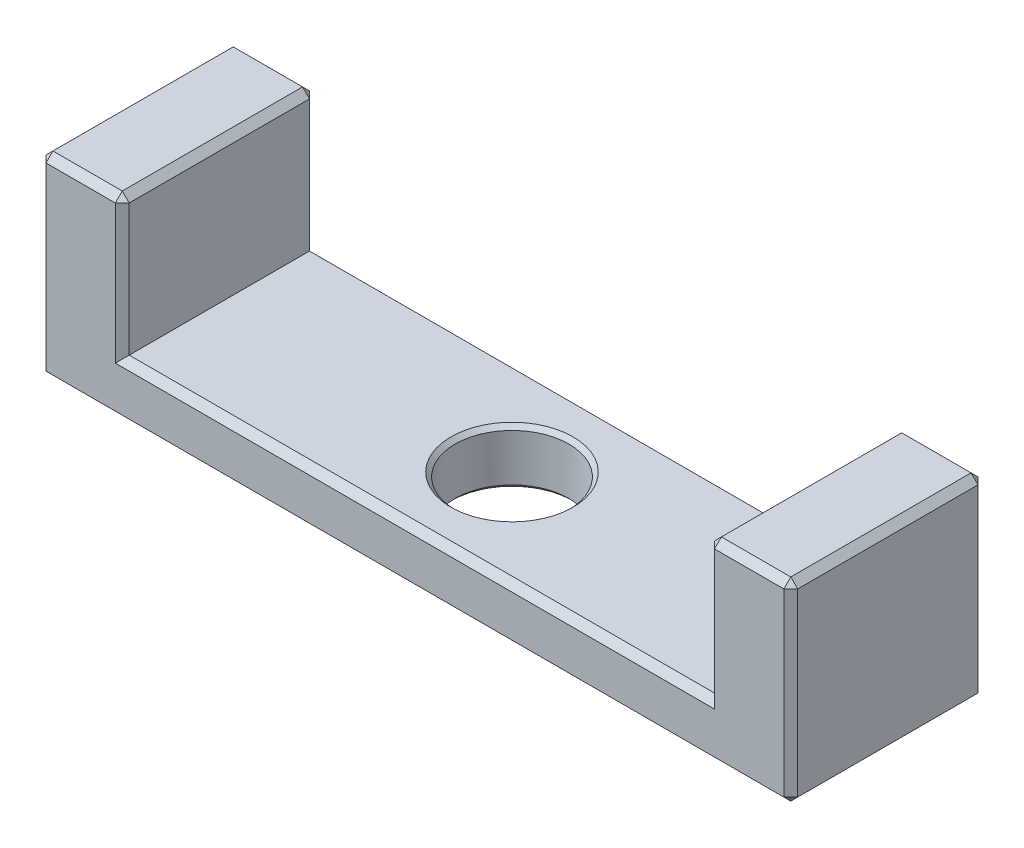
ISO-10303-21;
HEADER;
FILE_DESCRIPTION(('STEP AP214'),'2;1');
FILE_NAME('part.step','',(''),(''),'','','');
FILE_SCHEMA(('AUTOMOTIVE_DESIGN { 1 0 10303 214 1 1 1 1 }'));
ENDSEC;
DATA;
#1=APPLICATION_CONTEXT('core data for automotive mechanical design processes');
#2=APPLICATION_PROTOCOL_DEFINITION('international standard','automotive_design',2000,#1);
#3=PRODUCT_CONTEXT('',#1,'mechanical');
#4=PRODUCT('Part','Part','',(#3));
#5=PRODUCT_RELATED_PRODUCT_CATEGORY('part','',(#4));
#6=PRODUCT_DEFINITION_FORMATION('','',#4);
#7=PRODUCT_DEFINITION_CONTEXT('part definition',#1,'design');
#8=PRODUCT_DEFINITION('design','',#6,#7);
#9=PRODUCT_DEFINITION_SHAPE('','',#8);
#10=(LENGTH_UNIT() NAMED_UNIT(*) SI_UNIT(.MILLI.,.METRE.));
#11=(NAMED_UNIT(*) PLANE_ANGLE_UNIT() SI_UNIT($,.RADIAN.));
#12=(NAMED_UNIT(*) SI_UNIT($,.STERADIAN.) SOLID_ANGLE_UNIT());
#13=UNCERTAINTY_MEASURE_WITH_UNIT(LENGTH_MEASURE(1.E-05),#10,'distance_accuracy_value','');
#14=(GEOMETRIC_REPRESENTATION_CONTEXT(3) GLOBAL_UNCERTAINTY_ASSIGNED_CONTEXT((#13)) GLOBAL_UNIT_ASSIGNED_CONTEXT((#10,
#11,#12)) REPRESENTATION_CONTEXT('',''));
#15=CARTESIAN_POINT('',(0.,0.,0.));
#16=DIRECTION('',(0.,0.,1.));
#17=DIRECTION('',(1.,0.,0.));
#18=AXIS2_PLACEMENT_3D('',#15,#16,#17);
#19=CARTESIAN_POINT('',(-27.1,14.,7.));
#20=DIRECTION('',(0.,-1.,0.));
#21=DIRECTION('',(0.,0.,-1.));
#22=AXIS2_PLACEMENT_3D('',#19,#20,#21);
#23=PLANE('',#22);
#24=DIRECTION('',(1.,0.,0.));
#25=VECTOR('',#24,1.);
#26=CARTESIAN_POINT('',(-27.1,14.,6.49999999999999));
#27=LINE('',#26,#25);
#28=CARTESIAN_POINT('',(-26.6,14.,6.49999999999999));
#29=VERTEX_POINT('',#28);
#30=CARTESIAN_POINT('',(-21.6,14.,6.49999999999999));
#31=VERTEX_POINT('',#30);
#32=EDGE_CURVE('E286',#29,#31,#27,.T.);
#33=ORIENTED_EDGE('',*,*,#32,.T.);
#34=DIRECTION('',(0.,0.,-1.));
#35=VECTOR('',#34,1.);
#36=CARTESIAN_POINT('',(-21.6,14.,7.));
#37=LINE('',#36,#35);
#38=CARTESIAN_POINT('',(-21.6,14.,-6.49999999999999));
#39=VERTEX_POINT('',#38);
#40=EDGE_CURVE('E288',#31,#39,#37,.T.);
#41=ORIENTED_EDGE('',*,*,#40,.T.);
#42=DIRECTION('',(-1.,0.,0.));
#43=VECTOR('',#42,1.);
#44=CARTESIAN_POINT('',(-27.1,14.,-6.49999999999999));
#45=LINE('',#44,#43);
#46=CARTESIAN_POINT('',(-26.6,14.,-6.49999999999999));
#47=VERTEX_POINT('',#46);
#48=EDGE_CURVE('E282',#39,#47,#45,.T.);
#49=ORIENTED_EDGE('',*,*,#48,.T.);
#50=DIRECTION('',(0.,0.,1.));
#51=VECTOR('',#50,1.);
#52=CARTESIAN_POINT('',(-26.6,14.,7.));
#53=LINE('',#52,#51);
#54=EDGE_CURVE('E284',#47,#29,#53,.T.);
#55=ORIENTED_EDGE('',*,*,#54,.T.);
#56=EDGE_LOOP('',(#33,#41,#49,#55));
#57=FACE_BOUND('',#56,.T.);
#58=ADVANCED_FACE('F41',(#57),#23,.F.);
#59=CARTESIAN_POINT('',(-27.1,0.,7.));
#60=DIRECTION('',(1.,0.,0.));
#61=DIRECTION('',(0.,0.,-1.));
#62=AXIS2_PLACEMENT_3D('',#59,#60,#61);
#63=PLANE('',#62);
#64=DIRECTION('',(0.,1.,0.));
#65=VECTOR('',#64,1.);
#66=CARTESIAN_POINT('',(-27.1,0.,6.49999999999999));
#67=LINE('',#66,#65);
#68=CARTESIAN_POINT('',(-27.1,0.500000000000001,6.49999999999999));
#69=VERTEX_POINT('',#68);
#70=CARTESIAN_POINT('',(-27.1,13.5,6.49999999999999));
#71=VERTEX_POINT('',#70);
#72=EDGE_CURVE('E303',#69,#71,#67,.T.);
#73=ORIENTED_EDGE('',*,*,#72,.T.);
#74=DIRECTION('',(0.,0.,-1.));
#75=VECTOR('',#74,1.);
#76=CARTESIAN_POINT('',(-27.1,13.5,7.));
#77=LINE('',#76,#75);
#78=CARTESIAN_POINT('',(-27.1,13.5,-6.49999999999999));
#79=VERTEX_POINT('',#78);
#80=EDGE_CURVE('E307',#71,#79,#77,.T.);
#81=ORIENTED_EDGE('',*,*,#80,.T.);
#82=DIRECTION('',(0.,-1.,0.));
#83=VECTOR('',#82,1.);
#84=CARTESIAN_POINT('',(-27.1,0.,-6.49999999999999));
#85=LINE('',#84,#83);
#86=CARTESIAN_POINT('',(-27.1,0.500000000000001,-6.49999999999999));
#87=VERTEX_POINT('',#86);
#88=EDGE_CURVE('E305',#79,#87,#85,.T.);
#89=ORIENTED_EDGE('',*,*,#88,.T.);
#90=DIRECTION('',(0.,0.,1.));
#91=VECTOR('',#90,1.);
#92=CARTESIAN_POINT('',(-27.1,0.500000000000001,7.));
#93=LINE('',#92,#91);
#94=EDGE_CURVE('E301',#87,#69,#93,.T.);
#95=ORIENTED_EDGE('',*,*,#94,.T.);
#96=EDGE_LOOP('',(#73,#81,#89,#95));
#97=FACE_BOUND('',#96,.T.);
#98=ADVANCED_FACE('F450',(#97),#63,.F.);
#99=CARTESIAN_POINT('',(27.1,0.,7.));
#100=DIRECTION('',(0.,1.,0.));
#101=DIRECTION('',(0.,0.,1.));
#102=AXIS2_PLACEMENT_3D('',#99,#100,#101);
#103=PLANE('',#102);
#104=CARTESIAN_POINT('',(0.,0.,0.));
#105=DIRECTION('',(0.,1.,0.));
#106=DIRECTION('',(0.,0.,1.));
#107=AXIS2_PLACEMENT_3D('',#104,#105,#106);
#108=CIRCLE('',#107,4.4);
#109=CARTESIAN_POINT('',(0.,0.,4.4));
#110=VERTEX_POINT('',#109);
#111=EDGE_CURVE('E11',#110,#110,#108,.T.);
#112=ORIENTED_EDGE('',*,*,#111,.T.);
#113=EDGE_LOOP('',(#112));
#114=FACE_BOUND('',#113,.T.);
#115=DIRECTION('',(0.,0.,-1.));
#116=VECTOR('',#115,1.);
#117=CARTESIAN_POINT('',(-26.6,0.,7.));
#118=LINE('',#117,#116);
#119=CARTESIAN_POINT('',(-26.6,0.,6.49999999999999));
#120=VERTEX_POINT('',#119);
#121=CARTESIAN_POINT('',(-26.6,0.,-6.49999999999999));
#122=VERTEX_POINT('',#121);
#123=EDGE_CURVE('E310',#120,#122,#118,.T.);
#124=ORIENTED_EDGE('',*,*,#123,.T.);
#125=DIRECTION('',(1.,0.,0.));
#126=VECTOR('',#125,1.);
#127=CARTESIAN_POINT('',(27.1,0.,-6.49999999999999));
#128=LINE('',#127,#126);
#129=CARTESIAN_POINT('',(26.6,0.,-6.49999999999999));
#130=VERTEX_POINT('',#129);
#131=EDGE_CURVE('E315',#122,#130,#128,.T.);
#132=ORIENTED_EDGE('',*,*,#131,.T.);
#133=DIRECTION('',(0.,0.,1.));
#134=VECTOR('',#133,1.);
#135=CARTESIAN_POINT('',(26.6,0.,7.));
#136=LINE('',#135,#134);
#137=CARTESIAN_POINT('',(26.6,0.,6.49999999999999));
#138=VERTEX_POINT('',#137);
#139=EDGE_CURVE('E65',#130,#138,#136,.T.);
#140=ORIENTED_EDGE('',*,*,#139,.T.);
#141=DIRECTION('',(-1.,0.,0.));
#142=VECTOR('',#141,1.);
#143=CARTESIAN_POINT('',(27.1,0.,6.49999999999999));
#144=LINE('',#143,#142);
#145=EDGE_CURVE('E312',#138,#120,#144,.T.);
#146=ORIENTED_EDGE('',*,*,#145,.T.);
#147=EDGE_LOOP('',(#124,#132,#140,#146));
#148=FACE_BOUND('',#147,.T.);
#149=ADVANCED_FACE('F447',(#114,#148),#103,.F.);
#150=CARTESIAN_POINT('',(27.1,14.,7.));
#151=DIRECTION('',(-1.,0.,0.));
#152=DIRECTION('',(0.,0.,1.));
#153=AXIS2_PLACEMENT_3D('',#150,#151,#152);
#154=PLANE('',#153);
#155=DIRECTION('',(0.,1.,0.));
#156=VECTOR('',#155,1.);
#157=CARTESIAN_POINT('',(27.1,14.,-6.49999999999999));
#158=LINE('',#157,#156);
#159=CARTESIAN_POINT('',(27.1,0.5,-6.49999999999999));
#160=VERTEX_POINT('',#159);
#161=CARTESIAN_POINT('',(27.1,13.5,-6.49999999999999));
#162=VERTEX_POINT('',#161);
#163=EDGE_CURVE('E238',#160,#162,#158,.T.);
#164=ORIENTED_EDGE('',*,*,#163,.T.);
#165=DIRECTION('',(0.,0.,1.));
#166=VECTOR('',#165,1.);
#167=CARTESIAN_POINT('',(27.1,13.5,7.));
#168=LINE('',#167,#166);
#169=CARTESIAN_POINT('',(27.1,13.5,6.49999999999999));
#170=VERTEX_POINT('',#169);
#171=EDGE_CURVE('E201',#162,#170,#168,.T.);
#172=ORIENTED_EDGE('',*,*,#171,.T.);
#173=DIRECTION('',(0.,-1.,0.));
#174=VECTOR('',#173,1.);
#175=CARTESIAN_POINT('',(27.1,14.,6.49999999999999));
#176=LINE('',#175,#174);
#177=CARTESIAN_POINT('',(27.1,0.5,6.49999999999999));
#178=VERTEX_POINT('',#177);
#179=EDGE_CURVE('E232',#170,#178,#176,.T.);
#180=ORIENTED_EDGE('',*,*,#179,.T.);
#181=DIRECTION('',(0.,0.,-1.));
#182=VECTOR('',#181,1.);
#183=CARTESIAN_POINT('',(27.1,0.5,7.));
#184=LINE('',#183,#182);
#185=EDGE_CURVE('E230',#178,#160,#184,.T.);
#186=ORIENTED_EDGE('',*,*,#185,.T.);
#187=EDGE_LOOP('',(#164,#172,#180,#186));
#188=FACE_BOUND('',#187,.T.);
#189=ADVANCED_FACE('F449',(#188),#154,.F.);
#190=CARTESIAN_POINT('',(21.1,14.,7.));
#191=DIRECTION('',(0.,-1.,0.));
#192=DIRECTION('',(0.,0.,-1.));
#193=AXIS2_PLACEMENT_3D('',#190,#191,#192);
#194=PLANE('',#193);
#195=DIRECTION('',(1.,0.,0.));
#196=VECTOR('',#195,1.);
#197=CARTESIAN_POINT('',(21.1,14.,6.49999999999999));
#198=LINE('',#197,#196);
#199=CARTESIAN_POINT('',(21.6,14.,6.49999999999999));
#200=VERTEX_POINT('',#199);
#201=CARTESIAN_POINT('',(26.6,14.,6.49999999999999));
#202=VERTEX_POINT('',#201);
#203=EDGE_CURVE('E228',#200,#202,#198,.T.);
#204=ORIENTED_EDGE('',*,*,#203,.T.);
#205=DIRECTION('',(0.,0.,-1.));
#206=VECTOR('',#205,1.);
#207=CARTESIAN_POINT('',(26.6,14.,7.));
#208=LINE('',#207,#206);
#209=CARTESIAN_POINT('',(26.6,14.,-6.49999999999999));
#210=VERTEX_POINT('',#209);
#211=EDGE_CURVE('E199',#202,#210,#208,.T.);
#212=ORIENTED_EDGE('',*,*,#211,.T.);
#213=DIRECTION('',(-1.,0.,0.));
#214=VECTOR('',#213,1.);
#215=CARTESIAN_POINT('',(21.1,14.,-6.49999999999999));
#216=LINE('',#215,#214);
#217=CARTESIAN_POINT('',(21.6,14.,-6.49999999999999));
#218=VERTEX_POINT('',#217);
#219=EDGE_CURVE('E217',#210,#218,#216,.T.);
#220=ORIENTED_EDGE('',*,*,#219,.T.);
#221=DIRECTION('',(0.,0.,1.));
#222=VECTOR('',#221,1.);
#223=CARTESIAN_POINT('',(21.6,14.,7.));
#224=LINE('',#223,#222);
#225=EDGE_CURVE('E223',#218,#200,#224,.T.);
#226=ORIENTED_EDGE('',*,*,#225,.T.);
#227=EDGE_LOOP('',(#204,#212,#220,#226));
#228=FACE_BOUND('',#227,.T.);
#229=ADVANCED_FACE('F226',(#228),#194,.F.);
#230=CARTESIAN_POINT('',(21.1,4.,7.));
#231=DIRECTION('',(1.,0.,0.));
#232=DIRECTION('',(0.,0.,-1.));
#233=AXIS2_PLACEMENT_3D('',#230,#231,#232);
#234=PLANE('',#233);
#235=DIRECTION('',(0.,0.,-1.));
#236=VECTOR('',#235,1.);
#237=CARTESIAN_POINT('',(21.1,4.,7.));
#238=LINE('',#237,#236);
#239=CARTESIAN_POINT('',(21.1,4.,6.49999999999999));
#240=VERTEX_POINT('',#239);
#241=CARTESIAN_POINT('',(21.1,4.,-6.49999999999999));
#242=VERTEX_POINT('',#241);
#243=EDGE_CURVE('E224',#240,#242,#238,.T.);
#244=ORIENTED_EDGE('',*,*,#243,.F.);
#245=DIRECTION('',(0.,1.,0.));
#246=VECTOR('',#245,1.);
#247=CARTESIAN_POINT('',(21.1,4.,6.49999999999999));
#248=LINE('',#247,#246);
#249=CARTESIAN_POINT('',(21.1,13.5,6.49999999999999));
#250=VERTEX_POINT('',#249);
#251=EDGE_CURVE('E263',#240,#250,#248,.T.);
#252=ORIENTED_EDGE('',*,*,#251,.T.);
#253=DIRECTION('',(0.,0.,-1.));
#254=VECTOR('',#253,1.);
#255=CARTESIAN_POINT('',(21.1,13.5,7.));
#256=LINE('',#255,#254);
#257=CARTESIAN_POINT('',(21.1,13.5,-6.49999999999999));
#258=VERTEX_POINT('',#257);
#259=EDGE_CURVE('E260',#250,#258,#256,.T.);
#260=ORIENTED_EDGE('',*,*,#259,.T.);
#261=DIRECTION('',(0.,-1.,0.));
#262=VECTOR('',#261,1.);
#263=CARTESIAN_POINT('',(21.1,4.,-6.49999999999999));
#264=LINE('',#263,#262);
#265=EDGE_CURVE('E258',#258,#242,#264,.T.);
#266=ORIENTED_EDGE('',*,*,#265,.T.);
#267=EDGE_LOOP('',(#244,#252,#260,#266));
#268=FACE_BOUND('',#267,.T.);
#269=ADVANCED_FACE('F758',(#268),#234,.F.);
#270=CARTESIAN_POINT('',(-21.1,4.,7.));
#271=DIRECTION('',(0.,-1.,0.));
#272=DIRECTION('',(0.,0.,-1.));
#273=AXIS2_PLACEMENT_3D('',#270,#271,#272);
#274=PLANE('',#273);
#275=CARTESIAN_POINT('',(0.,4.,0.));
#276=DIRECTION('',(0.,-1.,0.));
#277=DIRECTION('',(0.,0.,-1.));
#278=AXIS2_PLACEMENT_3D('',#275,#276,#277);
#279=CIRCLE('',#278,4.40000000000001);
#280=CARTESIAN_POINT('',(0.,4.,-4.40000000000001));
#281=VERTEX_POINT('',#280);
#282=EDGE_CURVE('E50',#281,#281,#279,.T.);
#283=ORIENTED_EDGE('',*,*,#282,.T.);
#284=EDGE_LOOP('',(#283));
#285=FACE_BOUND('',#284,.T.);
#286=DIRECTION('',(0.,0.,-1.));
#287=VECTOR('',#286,1.);
#288=CARTESIAN_POINT('',(-21.1,4.,7.));
#289=LINE('',#288,#287);
#290=CARTESIAN_POINT('',(-21.1,4.,6.49999999999999));
#291=VERTEX_POINT('',#290);
#292=CARTESIAN_POINT('',(-21.1,4.,-6.49999999999999));
#293=VERTEX_POINT('',#292);
#294=EDGE_CURVE('E419',#291,#293,#289,.T.);
#295=ORIENTED_EDGE('',*,*,#294,.F.);
#296=DIRECTION('',(1.,0.,0.));
#297=VECTOR('',#296,1.);
#298=CARTESIAN_POINT('',(-21.1,4.,6.49999999999999));
#299=LINE('',#298,#297);
#300=EDGE_CURVE('E299',#291,#240,#299,.T.);
#301=ORIENTED_EDGE('',*,*,#300,.T.);
#302=ORIENTED_EDGE('',*,*,#243,.T.);
#303=DIRECTION('',(-1.,0.,0.));
#304=VECTOR('',#303,1.);
#305=CARTESIAN_POINT('',(-21.1,4.,-6.49999999999999));
#306=LINE('',#305,#304);
#307=EDGE_CURVE('E297',#242,#293,#306,.T.);
#308=ORIENTED_EDGE('',*,*,#307,.T.);
#309=EDGE_LOOP('',(#295,#301,#302,#308));
#310=FACE_BOUND('',#309,.T.);
#311=ADVANCED_FACE('F427',(#285,#310),#274,.F.);
#312=CARTESIAN_POINT('',(-21.1,14.,7.));
#313=DIRECTION('',(-1.,0.,0.));
#314=DIRECTION('',(0.,0.,1.));
#315=AXIS2_PLACEMENT_3D('',#312,#313,#314);
#316=PLANE('',#315);
#317=DIRECTION('',(0.,0.,1.));
#318=VECTOR('',#317,1.);
#319=CARTESIAN_POINT('',(-21.1,13.5,7.));
#320=LINE('',#319,#318);
#321=CARTESIAN_POINT('',(-21.1,13.5,-6.49999999999999));
#322=VERTEX_POINT('',#321);
#323=CARTESIAN_POINT('',(-21.1,13.5,6.49999999999999));
#324=VERTEX_POINT('',#323);
#325=EDGE_CURVE('E293',#322,#324,#320,.T.);
#326=ORIENTED_EDGE('',*,*,#325,.T.);
#327=DIRECTION('',(0.,-1.,0.));
#328=VECTOR('',#327,1.);
#329=CARTESIAN_POINT('',(-21.1,14.,6.49999999999999));
#330=LINE('',#329,#328);
#331=EDGE_CURVE('E295',#324,#291,#330,.T.);
#332=ORIENTED_EDGE('',*,*,#331,.T.);
#333=ORIENTED_EDGE('',*,*,#294,.T.);
#334=DIRECTION('',(0.,1.,0.));
#335=VECTOR('',#334,1.);
#336=CARTESIAN_POINT('',(-21.1,14.,-6.49999999999999));
#337=LINE('',#336,#335);
#338=EDGE_CURVE('E291',#293,#322,#337,.T.);
#339=ORIENTED_EDGE('',*,*,#338,.T.);
#340=EDGE_LOOP('',(#326,#332,#333,#339));
#341=FACE_BOUND('',#340,.T.);
#342=ADVANCED_FACE('F733',(#341),#316,.F.);
#343=CARTESIAN_POINT('',(0.,0.,7.));
#344=DIRECTION('',(0.,0.,-1.));
#345=DIRECTION('',(-1.,0.,0.));
#346=AXIS2_PLACEMENT_3D('',#343,#344,#345);
#347=PLANE('',#346);
#348=DIRECTION('',(0.,1.,0.));
#349=VECTOR('',#348,1.);
#350=CARTESIAN_POINT('',(26.6,0.,7.));
#351=LINE('',#350,#349);
#352=CARTESIAN_POINT('',(26.6,0.500000000000001,7.));
#353=VERTEX_POINT('',#352);
#354=CARTESIAN_POINT('',(26.6,13.5,7.));
#355=VERTEX_POINT('',#354);
#356=EDGE_CURVE('E243',#353,#355,#351,.T.);
#357=ORIENTED_EDGE('',*,*,#356,.T.);
#358=DIRECTION('',(-1.,0.,0.));
#359=VECTOR('',#358,1.);
#360=CARTESIAN_POINT('',(0.,13.5,7.));
#361=LINE('',#360,#359);
#362=CARTESIAN_POINT('',(21.6,13.5,7.));
#363=VERTEX_POINT('',#362);
#364=EDGE_CURVE('E255',#355,#363,#361,.T.);
#365=ORIENTED_EDGE('',*,*,#364,.T.);
#366=DIRECTION('',(0.,-1.,0.));
#367=VECTOR('',#366,1.);
#368=CARTESIAN_POINT('',(21.6,0.,7.));
#369=LINE('',#368,#367);
#370=CARTESIAN_POINT('',(21.6,3.49999999999999,7.));
#371=VERTEX_POINT('',#370);
#372=EDGE_CURVE('E253',#363,#371,#369,.T.);
#373=ORIENTED_EDGE('',*,*,#372,.T.);
#374=DIRECTION('',(-1.,0.,0.));
#375=VECTOR('',#374,1.);
#376=CARTESIAN_POINT('',(0.,3.49999999999999,7.));
#377=LINE('',#376,#375);
#378=CARTESIAN_POINT('',(-21.6,3.49999999999999,7.));
#379=VERTEX_POINT('',#378);
#380=EDGE_CURVE('E251',#371,#379,#377,.T.);
#381=ORIENTED_EDGE('',*,*,#380,.T.);
#382=DIRECTION('',(0.,1.,0.));
#383=VECTOR('',#382,1.);
#384=CARTESIAN_POINT('',(-21.6,0.,7.));
#385=LINE('',#384,#383);
#386=CARTESIAN_POINT('',(-21.6,13.5,7.));
#387=VERTEX_POINT('',#386);
#388=EDGE_CURVE('E249',#379,#387,#385,.T.);
#389=ORIENTED_EDGE('',*,*,#388,.T.);
#390=DIRECTION('',(-1.,0.,0.));
#391=VECTOR('',#390,1.);
#392=CARTESIAN_POINT('',(0.,13.5,7.));
#393=LINE('',#392,#391);
#394=CARTESIAN_POINT('',(-26.6,13.5,7.));
#395=VERTEX_POINT('',#394);
#396=EDGE_CURVE('E247',#387,#395,#393,.T.);
#397=ORIENTED_EDGE('',*,*,#396,.T.);
#398=DIRECTION('',(0.,-1.,0.));
#399=VECTOR('',#398,1.);
#400=CARTESIAN_POINT('',(-26.6,0.,7.));
#401=LINE('',#400,#399);
#402=CARTESIAN_POINT('',(-26.6,0.500000000000001,7.));
#403=VERTEX_POINT('',#402);
#404=EDGE_CURVE('E245',#395,#403,#401,.T.);
#405=ORIENTED_EDGE('',*,*,#404,.T.);
#406=DIRECTION('',(1.,0.,0.));
#407=VECTOR('',#406,1.);
#408=CARTESIAN_POINT('',(0.,0.500000000000001,7.));
#409=LINE('',#408,#407);
#410=EDGE_CURVE('E241',#403,#353,#409,.T.);
#411=ORIENTED_EDGE('',*,*,#410,.T.);
#412=EDGE_LOOP('',(#357,#365,#373,#381,#389,#397,#405,#411));
#413=FACE_BOUND('',#412,.T.);
#414=ADVANCED_FACE('F768',(#413),#347,.F.);
#415=CARTESIAN_POINT('',(0.,0.,-7.));
#416=DIRECTION('',(0.,0.,-1.));
#417=DIRECTION('',(-1.,0.,0.));
#418=AXIS2_PLACEMENT_3D('',#415,#416,#417);
#419=PLANE('',#418);
#420=DIRECTION('',(0.,1.,0.));
#421=VECTOR('',#420,1.);
#422=CARTESIAN_POINT('',(21.6,14.,-7.));
#423=LINE('',#422,#421);
#424=CARTESIAN_POINT('',(21.6,3.49999999999999,-7.));
#425=VERTEX_POINT('',#424);
#426=CARTESIAN_POINT('',(21.6,13.5,-7.));
#427=VERTEX_POINT('',#426);
#428=EDGE_CURVE('E277',#425,#427,#423,.T.);
#429=ORIENTED_EDGE('',*,*,#428,.T.);
#430=DIRECTION('',(1.,0.,0.));
#431=VECTOR('',#430,1.);
#432=CARTESIAN_POINT('',(27.1,13.5,-7.));
#433=LINE('',#432,#431);
#434=CARTESIAN_POINT('',(26.6,13.5,-7.));
#435=VERTEX_POINT('',#434);
#436=EDGE_CURVE('E279',#427,#435,#433,.T.);
#437=ORIENTED_EDGE('',*,*,#436,.T.);
#438=DIRECTION('',(0.,-1.,0.));
#439=VECTOR('',#438,1.);
#440=CARTESIAN_POINT('',(26.6,0.,-7.));
#441=LINE('',#440,#439);
#442=CARTESIAN_POINT('',(26.6,0.500000000000001,-7.));
#443=VERTEX_POINT('',#442);
#444=EDGE_CURVE('E265',#435,#443,#441,.T.);
#445=ORIENTED_EDGE('',*,*,#444,.T.);
#446=DIRECTION('',(-1.,0.,0.));
#447=VECTOR('',#446,1.);
#448=CARTESIAN_POINT('',(-27.1,0.500000000000001,-7.));
#449=LINE('',#448,#447);
#450=CARTESIAN_POINT('',(-26.6,0.500000000000001,-7.));
#451=VERTEX_POINT('',#450);
#452=EDGE_CURVE('E267',#443,#451,#449,.T.);
#453=ORIENTED_EDGE('',*,*,#452,.T.);
#454=DIRECTION('',(0.,1.,0.));
#455=VECTOR('',#454,1.);
#456=CARTESIAN_POINT('',(-26.6,14.,-7.));
#457=LINE('',#456,#455);
#458=CARTESIAN_POINT('',(-26.6,13.5,-7.));
#459=VERTEX_POINT('',#458);
#460=EDGE_CURVE('E269',#451,#459,#457,.T.);
#461=ORIENTED_EDGE('',*,*,#460,.T.);
#462=DIRECTION('',(1.,0.,0.));
#463=VECTOR('',#462,1.);
#464=CARTESIAN_POINT('',(-21.1,13.5,-7.));
#465=LINE('',#464,#463);
#466=CARTESIAN_POINT('',(-21.6,13.5,-7.));
#467=VERTEX_POINT('',#466);
#468=EDGE_CURVE('E271',#459,#467,#465,.T.);
#469=ORIENTED_EDGE('',*,*,#468,.T.);
#470=DIRECTION('',(0.,-1.,0.));
#471=VECTOR('',#470,1.);
#472=CARTESIAN_POINT('',(-21.6,4.,-7.));
#473=LINE('',#472,#471);
#474=CARTESIAN_POINT('',(-21.6,3.49999999999999,-7.));
#475=VERTEX_POINT('',#474);
#476=EDGE_CURVE('E273',#467,#475,#473,.T.);
#477=ORIENTED_EDGE('',*,*,#476,.T.);
#478=DIRECTION('',(1.,0.,0.));
#479=VECTOR('',#478,1.);
#480=CARTESIAN_POINT('',(21.1,3.49999999999999,-7.));
#481=LINE('',#480,#479);
#482=EDGE_CURVE('E275',#475,#425,#481,.T.);
#483=ORIENTED_EDGE('',*,*,#482,.T.);
#484=EDGE_LOOP('',(#429,#437,#445,#453,#461,#469,#477,#483));
#485=FACE_BOUND('',#484,.T.);
#486=ADVANCED_FACE('F439',(#485),#419,.T.);
#487=CARTESIAN_POINT('',(0.,0.,0.));
#488=DIRECTION('',(0.,1.,0.));
#489=DIRECTION('',(0.,0.,1.));
#490=AXIS2_PLACEMENT_3D('',#487,#488,#489);
#491=CYLINDRICAL_SURFACE('',#490,4.1);
#492=CARTESIAN_POINT('',(0.,3.69999999999999,0.));
#493=DIRECTION('',(0.,-1.,0.));
#494=DIRECTION('',(0.,0.,-1.));
#495=AXIS2_PLACEMENT_3D('',#492,#493,#494);
#496=CIRCLE('',#495,4.1);
#497=CARTESIAN_POINT('',(0.,3.69999999999999,-4.1));
#498=VERTEX_POINT('',#497);
#499=EDGE_CURVE('E422',#498,#498,#496,.F.);
#500=ORIENTED_EDGE('',*,*,#499,.T.);
#501=EDGE_LOOP('',(#500));
#502=FACE_BOUND('',#501,.T.);
#503=CARTESIAN_POINT('',(0.,0.3,0.));
#504=DIRECTION('',(0.,1.,0.));
#505=DIRECTION('',(0.,0.,1.));
#506=AXIS2_PLACEMENT_3D('',#503,#504,#505);
#507=CIRCLE('',#506,4.1);
#508=CARTESIAN_POINT('',(0.,0.3,4.1));
#509=VERTEX_POINT('',#508);
#510=EDGE_CURVE('E316',#509,#509,#507,.F.);
#511=ORIENTED_EDGE('',*,*,#510,.T.);
#512=EDGE_LOOP('',(#511));
#513=FACE_BOUND('',#512,.T.);
#514=ADVANCED_FACE('F435',(#502,#513),#491,.F.);
#515=CARTESIAN_POINT('',(0.,13.5,7.));
#516=DIRECTION('',(0.,-0.707106781186547,-0.707106781186547));
#517=DIRECTION('',(-1.,0.,0.));
#518=AXIS2_PLACEMENT_3D('',#515,#516,#517);
#519=PLANE('',#518);
#520=DIRECTION('',(0.,0.707106781186547,-0.707106781186547));
#521=VECTOR('',#520,1.);
#522=CARTESIAN_POINT('',(-21.6,13.75,6.75));
#523=LINE('',#522,#521);
#524=EDGE_CURVE('E410',#31,#387,#523,.F.);
#525=ORIENTED_EDGE('',*,*,#524,.F.);
#526=ORIENTED_EDGE('',*,*,#32,.F.);
#527=DIRECTION('',(0.,-0.707106781186547,0.707106781186547));
#528=VECTOR('',#527,1.);
#529=CARTESIAN_POINT('',(-26.6,13.5,7.));
#530=LINE('',#529,#528);
#531=EDGE_CURVE('E413',#395,#29,#530,.F.);
#532=ORIENTED_EDGE('',*,*,#531,.F.);
#533=ORIENTED_EDGE('',*,*,#396,.F.);
#534=EDGE_LOOP('',(#525,#526,#532,#533));
#535=FACE_BOUND('',#534,.T.);
#536=ADVANCED_FACE('F438',(#535),#519,.F.);
#537=CARTESIAN_POINT('',(-21.6,14.,7.));
#538=DIRECTION('',(-0.707106781186547,-0.707106781186547,0.));
#539=DIRECTION('',(0.,0.,-1.));
#540=AXIS2_PLACEMENT_3D('',#537,#538,#539);
#541=PLANE('',#540);
#542=DIRECTION('',(-0.707106781186547,0.707106781186547,0.));
#543=VECTOR('',#542,1.);
#544=CARTESIAN_POINT('',(-21.6,14.,-6.49999999999999));
#545=LINE('',#544,#543);
#546=EDGE_CURVE('E404',#39,#322,#545,.F.);
#547=ORIENTED_EDGE('',*,*,#546,.F.);
#548=ORIENTED_EDGE('',*,*,#40,.F.);
#549=DIRECTION('',(0.707106781186547,-0.707106781186547,0.));
#550=VECTOR('',#549,1.);
#551=CARTESIAN_POINT('',(-21.1,13.5,6.49999999999999));
#552=LINE('',#551,#550);
#553=EDGE_CURVE('E407',#324,#31,#552,.F.);
#554=ORIENTED_EDGE('',*,*,#553,.F.);
#555=ORIENTED_EDGE('',*,*,#325,.F.);
#556=EDGE_LOOP('',(#547,#548,#554,#555));
#557=FACE_BOUND('',#556,.T.);
#558=ADVANCED_FACE('F506',(#557),#541,.F.);
#559=CARTESIAN_POINT('',(-27.1,14.,-6.49999999999999));
#560=DIRECTION('',(0.,0.707106781186547,-0.707106781186547));
#561=DIRECTION('',(1.,0.,0.));
#562=AXIS2_PLACEMENT_3D('',#559,#560,#561);
#563=PLANE('',#562);
#564=DIRECTION('',(0.,-0.707106781186547,-0.707106781186547));
#565=VECTOR('',#564,1.);
#566=CARTESIAN_POINT('',(-26.6,13.75,-6.75));
#567=LINE('',#566,#565);
#568=EDGE_CURVE('E399',#47,#459,#567,.T.);
#569=ORIENTED_EDGE('',*,*,#568,.F.);
#570=ORIENTED_EDGE('',*,*,#48,.F.);
#571=DIRECTION('',(0.,0.707106781186547,0.707106781186547));
#572=VECTOR('',#571,1.);
#573=CARTESIAN_POINT('',(-21.6,14.,-6.49999999999999));
#574=LINE('',#573,#572);
#575=EDGE_CURVE('E402',#467,#39,#574,.T.);
#576=ORIENTED_EDGE('',*,*,#575,.F.);
#577=ORIENTED_EDGE('',*,*,#468,.F.);
#578=EDGE_LOOP('',(#569,#570,#576,#577));
#579=FACE_BOUND('',#578,.T.);
#580=ADVANCED_FACE('F515',(#579),#563,.T.);
#581=CARTESIAN_POINT('',(-27.1,13.5,7.));
#582=DIRECTION('',(0.707106781186547,-0.707106781186547,0.));
#583=DIRECTION('',(0.,0.,-1.));
#584=AXIS2_PLACEMENT_3D('',#581,#582,#583);
#585=PLANE('',#584);
#586=DIRECTION('',(0.707106781186547,0.707106781186547,0.));
#587=VECTOR('',#586,1.);
#588=CARTESIAN_POINT('',(-26.85,13.75,6.49999999999999));
#589=LINE('',#588,#587);
#590=EDGE_CURVE('E416',#29,#71,#589,.F.);
#591=ORIENTED_EDGE('',*,*,#590,.F.);
#592=ORIENTED_EDGE('',*,*,#54,.F.);
#593=DIRECTION('',(-0.707106781186547,-0.707106781186547,0.));
#594=VECTOR('',#593,1.);
#595=CARTESIAN_POINT('',(-27.1,13.5,-6.49999999999999));
#596=LINE('',#595,#594);
#597=EDGE_CURVE('E396',#79,#47,#596,.F.);
#598=ORIENTED_EDGE('',*,*,#597,.F.);
#599=ORIENTED_EDGE('',*,*,#80,.F.);
#600=EDGE_LOOP('',(#591,#592,#598,#599));
#601=FACE_BOUND('',#600,.T.);
#602=ADVANCED_FACE('F492',(#601),#585,.F.);
#603=CARTESIAN_POINT('',(-26.6,13.5,7.));
#604=DIRECTION('',(-0.577350269189626,0.577350269189626,0.577350269189626));
#605=DIRECTION('',(0.707106781186547,0.,0.707106781186547));
#606=AXIS2_PLACEMENT_3D('',#603,#604,#605);
#607=PLANE('',#606);
#608=ORIENTED_EDGE('',*,*,#531,.T.);
#609=ORIENTED_EDGE('',*,*,#590,.T.);
#610=DIRECTION('',(-0.707106781186547,0.,-0.707106781186547));
#611=VECTOR('',#610,1.);
#612=CARTESIAN_POINT('',(-26.6,13.5,7.));
#613=LINE('',#612,#611);
#614=EDGE_CURVE('E393',#395,#71,#613,.T.);
#615=ORIENTED_EDGE('',*,*,#614,.F.);
#616=EDGE_LOOP('',(#608,#609,#615));
#617=FACE_BOUND('',#616,.T.);
#618=ADVANCED_FACE('F495',(#617),#607,.T.);
#619=CARTESIAN_POINT('',(-21.1,13.5,6.49999999999999));
#620=DIRECTION('',(0.577350269189626,0.577350269189626,0.577350269189626));
#621=DIRECTION('',(0.707106781186547,0.,-0.707106781186547));
#622=AXIS2_PLACEMENT_3D('',#619,#620,#621);
#623=PLANE('',#622);
#624=ORIENTED_EDGE('',*,*,#553,.T.);
#625=ORIENTED_EDGE('',*,*,#524,.T.);
#626=DIRECTION('',(-0.707106781186547,0.,0.707106781186547));
#627=VECTOR('',#626,1.);
#628=CARTESIAN_POINT('',(-21.1,13.5,6.49999999999999));
#629=LINE('',#628,#627);
#630=EDGE_CURVE('E390',#324,#387,#629,.T.);
#631=ORIENTED_EDGE('',*,*,#630,.F.);
#632=EDGE_LOOP('',(#624,#625,#631));
#633=FACE_BOUND('',#632,.T.);
#634=ADVANCED_FACE('F680',(#633),#623,.T.);
#635=CARTESIAN_POINT('',(-21.6,14.,-6.49999999999999));
#636=DIRECTION('',(0.577350269189626,0.577350269189626,-0.577350269189626));
#637=DIRECTION('',(-0.707106781186547,0.,-0.707106781186547));
#638=AXIS2_PLACEMENT_3D('',#635,#636,#637);
#639=PLANE('',#638);
#640=ORIENTED_EDGE('',*,*,#575,.T.);
#641=ORIENTED_EDGE('',*,*,#546,.T.);
#642=DIRECTION('',(-0.707106781186547,0.,-0.707106781186547));
#643=VECTOR('',#642,1.);
#644=CARTESIAN_POINT('',(-21.35,13.5,-6.75));
#645=LINE('',#644,#643);
#646=EDGE_CURVE('E387',#467,#322,#645,.F.);
#647=ORIENTED_EDGE('',*,*,#646,.F.);
#648=EDGE_LOOP('',(#640,#641,#647));
#649=FACE_BOUND('',#648,.T.);
#650=ADVANCED_FACE('F675',(#649),#639,.T.);
#651=CARTESIAN_POINT('',(-27.1,13.5,-6.49999999999999));
#652=DIRECTION('',(-0.577350269189626,0.577350269189626,-0.577350269189626));
#653=DIRECTION('',(-0.707106781186547,0.,0.707106781186547));
#654=AXIS2_PLACEMENT_3D('',#651,#652,#653);
#655=PLANE('',#654);
#656=ORIENTED_EDGE('',*,*,#597,.T.);
#657=ORIENTED_EDGE('',*,*,#568,.T.);
#658=DIRECTION('',(-0.707106781186547,0.,0.707106781186547));
#659=VECTOR('',#658,1.);
#660=CARTESIAN_POINT('',(-27.1,13.5,-6.49999999999999));
#661=LINE('',#660,#659);
#662=EDGE_CURVE('E384',#79,#459,#661,.F.);
#663=ORIENTED_EDGE('',*,*,#662,.F.);
#664=EDGE_LOOP('',(#656,#657,#663));
#665=FACE_BOUND('',#664,.T.);
#666=ADVANCED_FACE('F519',(#665),#655,.T.);
#667=CARTESIAN_POINT('',(-26.6,0.,7.));
#668=DIRECTION('',(0.707106781186547,0.,-0.707106781186547));
#669=DIRECTION('',(0.,-1.,0.));
#670=AXIS2_PLACEMENT_3D('',#667,#668,#669);
#671=PLANE('',#670);
#672=ORIENTED_EDGE('',*,*,#614,.T.);
#673=ORIENTED_EDGE('',*,*,#72,.F.);
#674=DIRECTION('',(0.707106781186547,0.,0.707106781186547));
#675=VECTOR('',#674,1.);
#676=CARTESIAN_POINT('',(-26.6,0.500000000000001,7.));
#677=LINE('',#676,#675);
#678=EDGE_CURVE('E378',#403,#69,#677,.F.);
#679=ORIENTED_EDGE('',*,*,#678,.F.);
#680=ORIENTED_EDGE('',*,*,#404,.F.);
#681=EDGE_LOOP('',(#672,#673,#679,#680));
#682=FACE_BOUND('',#681,.T.);
#683=ADVANCED_FACE('F485',(#682),#671,.F.);
#684=CARTESIAN_POINT('',(-21.6,0.,7.));
#685=DIRECTION('',(-0.707106781186547,0.,-0.707106781186547));
#686=DIRECTION('',(0.,1.,0.));
#687=AXIS2_PLACEMENT_3D('',#684,#685,#686);
#688=PLANE('',#687);
#689=ORIENTED_EDGE('',*,*,#630,.T.);
#690=ORIENTED_EDGE('',*,*,#388,.F.);
#691=DIRECTION('',(0.577350269189626,0.577350269189626,-0.577350269189626));
#692=VECTOR('',#691,1.);
#693=CARTESIAN_POINT('',(-14.4,10.7,-0.200000000000004));
#694=LINE('',#693,#692);
#695=EDGE_CURVE('E375',#291,#379,#694,.F.);
#696=ORIENTED_EDGE('',*,*,#695,.F.);
#697=ORIENTED_EDGE('',*,*,#331,.F.);
#698=EDGE_LOOP('',(#689,#690,#696,#697));
#699=FACE_BOUND('',#698,.T.);
#700=ADVANCED_FACE('F662',(#699),#688,.F.);
#701=CARTESIAN_POINT('',(-21.1,14.,-6.49999999999999));
#702=DIRECTION('',(0.707106781186547,0.,-0.707106781186547));
#703=DIRECTION('',(0.,-1.,0.));
#704=AXIS2_PLACEMENT_3D('',#701,#702,#703);
#705=PLANE('',#704);
#706=ORIENTED_EDGE('',*,*,#646,.T.);
#707=ORIENTED_EDGE('',*,*,#338,.F.);
#708=DIRECTION('',(-0.577350269189626,-0.577350269189626,-0.577350269189626));
#709=VECTOR('',#708,1.);
#710=CARTESIAN_POINT('',(-21.1,4.,-6.49999999999999));
#711=LINE('',#710,#709);
#712=EDGE_CURVE('E372',#475,#293,#711,.F.);
#713=ORIENTED_EDGE('',*,*,#712,.F.);
#714=ORIENTED_EDGE('',*,*,#476,.F.);
#715=EDGE_LOOP('',(#706,#707,#713,#714));
#716=FACE_BOUND('',#715,.T.);
#717=ADVANCED_FACE('F657',(#716),#705,.T.);
#718=CARTESIAN_POINT('',(-27.1,0.,-6.49999999999999));
#719=DIRECTION('',(-0.707106781186547,0.,-0.707106781186547));
#720=DIRECTION('',(0.,1.,0.));
#721=AXIS2_PLACEMENT_3D('',#718,#719,#720);
#722=PLANE('',#721);
#723=ORIENTED_EDGE('',*,*,#662,.T.);
#724=ORIENTED_EDGE('',*,*,#460,.F.);
#725=DIRECTION('',(0.707106781186547,0.,-0.707106781186547));
#726=VECTOR('',#725,1.);
#727=CARTESIAN_POINT('',(-27.1,0.500000000000001,-6.49999999999999));
#728=LINE('',#727,#726);
#729=EDGE_CURVE('E369',#87,#451,#728,.T.);
#730=ORIENTED_EDGE('',*,*,#729,.F.);
#731=ORIENTED_EDGE('',*,*,#88,.F.);
#732=EDGE_LOOP('',(#723,#724,#730,#731));
#733=FACE_BOUND('',#732,.T.);
#734=ADVANCED_FACE('F522',(#733),#722,.T.);
#735=CARTESIAN_POINT('',(-26.6,0.,7.));
#736=DIRECTION('',(0.707106781186547,0.707106781186547,0.));
#737=DIRECTION('',(0.,0.,-1.));
#738=AXIS2_PLACEMENT_3D('',#735,#736,#737);
#739=PLANE('',#738);
#740=DIRECTION('',(-0.707106781186547,0.707106781186547,0.));
#741=VECTOR('',#740,1.);
#742=CARTESIAN_POINT('',(-26.85,0.249999999999997,6.49999999999999));
#743=LINE('',#742,#741);
#744=EDGE_CURVE('E381',#69,#120,#743,.F.);
#745=ORIENTED_EDGE('',*,*,#744,.F.);
#746=ORIENTED_EDGE('',*,*,#94,.F.);
#747=DIRECTION('',(0.707106781186547,-0.707106781186547,0.));
#748=VECTOR('',#747,1.);
#749=CARTESIAN_POINT('',(-27.1,0.500000000000001,-6.49999999999999));
#750=LINE('',#749,#748);
#751=EDGE_CURVE('E366',#122,#87,#750,.F.);
#752=ORIENTED_EDGE('',*,*,#751,.F.);
#753=ORIENTED_EDGE('',*,*,#123,.F.);
#754=EDGE_LOOP('',(#745,#746,#752,#753));
#755=FACE_BOUND('',#754,.T.);
#756=ADVANCED_FACE('F459',(#755),#739,.F.);
#757=CARTESIAN_POINT('',(-26.6,0.500000000000001,7.));
#758=DIRECTION('',(-0.577350269189626,-0.577350269189626,0.577350269189626));
#759=DIRECTION('',(0.707106781186547,0.,0.707106781186547));
#760=AXIS2_PLACEMENT_3D('',#757,#758,#759);
#761=PLANE('',#760);
#762=ORIENTED_EDGE('',*,*,#678,.T.);
#763=ORIENTED_EDGE('',*,*,#744,.T.);
#764=DIRECTION('',(0.,-0.707106781186547,-0.707106781186547));
#765=VECTOR('',#764,1.);
#766=CARTESIAN_POINT('',(-26.6,0.500000000000001,7.));
#767=LINE('',#766,#765);
#768=EDGE_CURVE('E363',#403,#120,#767,.T.);
#769=ORIENTED_EDGE('',*,*,#768,.F.);
#770=EDGE_LOOP('',(#762,#763,#769));
#771=FACE_BOUND('',#770,.T.);
#772=ADVANCED_FACE('F480',(#771),#761,.T.);
#773=CARTESIAN_POINT('',(0.,3.49999999999999,7.));
#774=DIRECTION('',(0.,-0.707106781186547,-0.707106781186547));
#775=DIRECTION('',(-1.,0.,0.));
#776=AXIS2_PLACEMENT_3D('',#773,#774,#775);
#777=PLANE('',#776);
#778=ORIENTED_EDGE('',*,*,#695,.T.);
#779=ORIENTED_EDGE('',*,*,#380,.F.);
#780=DIRECTION('',(-0.577350269189626,0.577350269189626,-0.577350269189626));
#781=VECTOR('',#780,1.);
#782=CARTESIAN_POINT('',(22.7666666666667,2.33333333333333,8.16666666666666));
#783=LINE('',#782,#781);
#784=EDGE_CURVE('E360',#240,#371,#783,.F.);
#785=ORIENTED_EDGE('',*,*,#784,.F.);
#786=ORIENTED_EDGE('',*,*,#300,.F.);
#787=EDGE_LOOP('',(#778,#779,#785,#786));
#788=FACE_BOUND('',#787,.T.);
#789=ADVANCED_FACE('F640',(#788),#777,.F.);
#790=CARTESIAN_POINT('',(-21.1,4.,-6.49999999999999));
#791=DIRECTION('',(0.,0.707106781186547,-0.707106781186547));
#792=DIRECTION('',(1.,0.,0.));
#793=AXIS2_PLACEMENT_3D('',#790,#791,#792);
#794=PLANE('',#793);
#795=ORIENTED_EDGE('',*,*,#712,.T.);
#796=ORIENTED_EDGE('',*,*,#307,.F.);
#797=DIRECTION('',(0.577350269189626,-0.577350269189626,-0.577350269189626));
#798=VECTOR('',#797,1.);
#799=CARTESIAN_POINT('',(21.1,4.,-6.49999999999999));
#800=LINE('',#799,#798);
#801=EDGE_CURVE('E357',#425,#242,#800,.F.);
#802=ORIENTED_EDGE('',*,*,#801,.F.);
#803=ORIENTED_EDGE('',*,*,#482,.F.);
#804=EDGE_LOOP('',(#795,#796,#802,#803));
#805=FACE_BOUND('',#804,.T.);
#806=ADVANCED_FACE('F635',(#805),#794,.T.);
#807=CARTESIAN_POINT('',(-27.1,0.500000000000001,-6.49999999999999));
#808=DIRECTION('',(-0.577350269189626,-0.577350269189626,-0.577350269189626));
#809=DIRECTION('',(-0.707106781186547,0.,0.707106781186547));
#810=AXIS2_PLACEMENT_3D('',#807,#808,#809);
#811=PLANE('',#810);
#812=ORIENTED_EDGE('',*,*,#751,.T.);
#813=ORIENTED_EDGE('',*,*,#729,.T.);
#814=DIRECTION('',(0.,-0.707106781186547,0.707106781186547));
#815=VECTOR('',#814,1.);
#816=CARTESIAN_POINT('',(-26.6,0.249999999999997,-6.75));
#817=LINE('',#816,#815);
#818=EDGE_CURVE('E354',#122,#451,#817,.F.);
#819=ORIENTED_EDGE('',*,*,#818,.F.);
#820=EDGE_LOOP('',(#812,#813,#819));
#821=FACE_BOUND('',#820,.T.);
#822=ADVANCED_FACE('F462',(#821),#811,.T.);
#823=CARTESIAN_POINT('',(0.,0.500000000000001,7.));
#824=DIRECTION('',(0.,0.707106781186547,-0.707106781186547));
#825=DIRECTION('',(1.,0.,0.));
#826=AXIS2_PLACEMENT_3D('',#823,#824,#825);
#827=PLANE('',#826);
#828=ORIENTED_EDGE('',*,*,#768,.T.);
#829=ORIENTED_EDGE('',*,*,#145,.F.);
#830=DIRECTION('',(0.,0.707106781186547,0.707106781186547));
#831=VECTOR('',#830,1.);
#832=CARTESIAN_POINT('',(26.6,0.249999999999997,6.75));
#833=LINE('',#832,#831);
#834=EDGE_CURVE('E348',#353,#138,#833,.F.);
#835=ORIENTED_EDGE('',*,*,#834,.F.);
#836=ORIENTED_EDGE('',*,*,#410,.F.);
#837=EDGE_LOOP('',(#828,#829,#835,#836));
#838=FACE_BOUND('',#837,.T.);
#839=ADVANCED_FACE('F477',(#838),#827,.F.);
#840=CARTESIAN_POINT('',(21.6,0.,7.));
#841=DIRECTION('',(0.707106781186547,0.,-0.707106781186547));
#842=DIRECTION('',(0.,-1.,0.));
#843=AXIS2_PLACEMENT_3D('',#840,#841,#842);
#844=PLANE('',#843);
#845=ORIENTED_EDGE('',*,*,#784,.T.);
#846=ORIENTED_EDGE('',*,*,#372,.F.);
#847=DIRECTION('',(-0.707106781186547,0.,-0.707106781186547));
#848=VECTOR('',#847,1.);
#849=CARTESIAN_POINT('',(21.6,13.5,7.));
#850=LINE('',#849,#848);
#851=EDGE_CURVE('E345',#250,#363,#850,.F.);
#852=ORIENTED_EDGE('',*,*,#851,.F.);
#853=ORIENTED_EDGE('',*,*,#251,.F.);
#854=EDGE_LOOP('',(#845,#846,#852,#853));
#855=FACE_BOUND('',#854,.T.);
#856=ADVANCED_FACE('F622',(#855),#844,.F.);
#857=CARTESIAN_POINT('',(21.1,13.5,7.));
#858=DIRECTION('',(0.707106781186547,-0.707106781186547,0.));
#859=DIRECTION('',(0.,0.,-1.));
#860=AXIS2_PLACEMENT_3D('',#857,#858,#859);
#861=PLANE('',#860);
#862=DIRECTION('',(-0.707106781186547,-0.707106781186547,0.));
#863=VECTOR('',#862,1.);
#864=CARTESIAN_POINT('',(21.1,13.5,-6.49999999999999));
#865=LINE('',#864,#863);
#866=EDGE_CURVE('E339',#258,#218,#865,.F.);
#867=ORIENTED_EDGE('',*,*,#866,.F.);
#868=ORIENTED_EDGE('',*,*,#259,.F.);
#869=DIRECTION('',(0.707106781186547,0.707106781186547,0.));
#870=VECTOR('',#869,1.);
#871=CARTESIAN_POINT('',(21.35,13.75,6.49999999999999));
#872=LINE('',#871,#870);
#873=EDGE_CURVE('E342',#200,#250,#872,.F.);
#874=ORIENTED_EDGE('',*,*,#873,.F.);
#875=ORIENTED_EDGE('',*,*,#225,.F.);
#876=EDGE_LOOP('',(#867,#868,#874,#875));
#877=FACE_BOUND('',#876,.T.);
#878=ADVANCED_FACE('F617',(#877),#861,.F.);
#879=CARTESIAN_POINT('',(21.1,4.,-6.49999999999999));
#880=DIRECTION('',(-0.707106781186547,0.,-0.707106781186547));
#881=DIRECTION('',(0.,1.,0.));
#882=AXIS2_PLACEMENT_3D('',#879,#880,#881);
#883=PLANE('',#882);
#884=ORIENTED_EDGE('',*,*,#801,.T.);
#885=ORIENTED_EDGE('',*,*,#265,.F.);
#886=DIRECTION('',(-0.707106781186547,0.,0.707106781186547));
#887=VECTOR('',#886,1.);
#888=CARTESIAN_POINT('',(21.1,13.5,-6.49999999999999));
#889=LINE('',#888,#887);
#890=EDGE_CURVE('E337',#427,#258,#889,.T.);
#891=ORIENTED_EDGE('',*,*,#890,.F.);
#892=ORIENTED_EDGE('',*,*,#428,.F.);
#893=EDGE_LOOP('',(#884,#885,#891,#892));
#894=FACE_BOUND('',#893,.T.);
#895=ADVANCED_FACE('F612',(#894),#883,.T.);
#896=CARTESIAN_POINT('',(27.1,0.,-6.49999999999999));
#897=DIRECTION('',(0.,-0.707106781186547,-0.707106781186547));
#898=DIRECTION('',(-1.,0.,0.));
#899=AXIS2_PLACEMENT_3D('',#896,#897,#898);
#900=PLANE('',#899);
#901=ORIENTED_EDGE('',*,*,#818,.T.);
#902=ORIENTED_EDGE('',*,*,#452,.F.);
#903=DIRECTION('',(0.,0.707106781186547,-0.707106781186547));
#904=VECTOR('',#903,1.);
#905=CARTESIAN_POINT('',(26.6,0.,-6.49999999999999));
#906=LINE('',#905,#904);
#907=EDGE_CURVE('E335',#130,#443,#906,.T.);
#908=ORIENTED_EDGE('',*,*,#907,.F.);
#909=ORIENTED_EDGE('',*,*,#131,.F.);
#910=EDGE_LOOP('',(#901,#902,#908,#909));
#911=FACE_BOUND('',#910,.T.);
#912=ADVANCED_FACE('F465',(#911),#900,.T.);
#913=CARTESIAN_POINT('',(27.1,0.5,7.));
#914=DIRECTION('',(-0.707106781186547,0.707106781186548,0.));
#915=DIRECTION('',(0.,0.,-1.));
#916=AXIS2_PLACEMENT_3D('',#913,#914,#915);
#917=PLANE('',#916);
#918=DIRECTION('',(-0.707106781186548,-0.707106781186547,0.));
#919=VECTOR('',#918,1.);
#920=CARTESIAN_POINT('',(27.1,0.5,6.49999999999999));
#921=LINE('',#920,#919);
#922=EDGE_CURVE('E351',#138,#178,#921,.F.);
#923=ORIENTED_EDGE('',*,*,#922,.F.);
#924=ORIENTED_EDGE('',*,*,#139,.F.);
#925=DIRECTION('',(0.707106781186548,0.707106781186547,0.));
#926=VECTOR('',#925,1.);
#927=CARTESIAN_POINT('',(26.6,0.,-6.49999999999999));
#928=LINE('',#927,#926);
#929=EDGE_CURVE('E57',#160,#130,#928,.F.);
#930=ORIENTED_EDGE('',*,*,#929,.F.);
#931=ORIENTED_EDGE('',*,*,#185,.F.);
#932=EDGE_LOOP('',(#923,#924,#930,#931));
#933=FACE_BOUND('',#932,.T.);
#934=ADVANCED_FACE('F468',(#933),#917,.F.);
#935=CARTESIAN_POINT('',(27.1,0.5,6.49999999999999));
#936=DIRECTION('',(0.577350269189626,-0.577350269189626,0.577350269189626));
#937=DIRECTION('',(0.,-0.707106781186548,-0.707106781186548));
#938=AXIS2_PLACEMENT_3D('',#935,#936,#937);
#939=PLANE('',#938);
#940=ORIENTED_EDGE('',*,*,#834,.T.);
#941=ORIENTED_EDGE('',*,*,#922,.T.);
#942=DIRECTION('',(0.707106781186547,0.,-0.707106781186547));
#943=VECTOR('',#942,1.);
#944=CARTESIAN_POINT('',(27.1,0.5,6.49999999999999));
#945=LINE('',#944,#943);
#946=EDGE_CURVE('E331',#353,#178,#945,.T.);
#947=ORIENTED_EDGE('',*,*,#946,.F.);
#948=EDGE_LOOP('',(#940,#941,#947));
#949=FACE_BOUND('',#948,.T.);
#950=ADVANCED_FACE('F473',(#949),#939,.T.);
#951=CARTESIAN_POINT('',(21.6,13.5,7.));
#952=DIRECTION('',(-0.577350269189626,0.577350269189626,0.577350269189626));
#953=DIRECTION('',(0.707106781186547,0.,0.707106781186547));
#954=AXIS2_PLACEMENT_3D('',#951,#952,#953);
#955=PLANE('',#954);
#956=ORIENTED_EDGE('',*,*,#873,.T.);
#957=ORIENTED_EDGE('',*,*,#851,.T.);
#958=DIRECTION('',(0.,-0.707106781186547,0.707106781186547));
#959=VECTOR('',#958,1.);
#960=CARTESIAN_POINT('',(21.6,13.5,7.));
#961=LINE('',#960,#959);
#962=EDGE_CURVE('E329',#200,#363,#961,.T.);
#963=ORIENTED_EDGE('',*,*,#962,.F.);
#964=EDGE_LOOP('',(#956,#957,#963));
#965=FACE_BOUND('',#964,.T.);
#966=ADVANCED_FACE('F539',(#965),#955,.T.);
#967=CARTESIAN_POINT('',(21.1,13.5,-6.49999999999999));
#968=DIRECTION('',(-0.577350269189626,0.577350269189626,-0.577350269189626));
#969=DIRECTION('',(-0.707106781186547,0.,0.707106781186547));
#970=AXIS2_PLACEMENT_3D('',#967,#968,#969);
#971=PLANE('',#970);
#972=ORIENTED_EDGE('',*,*,#890,.T.);
#973=ORIENTED_EDGE('',*,*,#866,.T.);
#974=DIRECTION('',(0.,-0.707106781186547,-0.707106781186547));
#975=VECTOR('',#974,1.);
#976=CARTESIAN_POINT('',(21.6,13.75,-6.75));
#977=LINE('',#976,#975);
#978=EDGE_CURVE('E220',#427,#218,#977,.F.);
#979=ORIENTED_EDGE('',*,*,#978,.F.);
#980=EDGE_LOOP('',(#972,#973,#979));
#981=FACE_BOUND('',#980,.T.);
#982=ADVANCED_FACE('F530',(#981),#971,.T.);
#983=CARTESIAN_POINT('',(26.6,0.,-6.49999999999999));
#984=DIRECTION('',(0.577350269189626,-0.577350269189626,-0.577350269189626));
#985=DIRECTION('',(0.,0.707106781186548,-0.707106781186548));
#986=AXIS2_PLACEMENT_3D('',#983,#984,#985);
#987=PLANE('',#986);
#988=ORIENTED_EDGE('',*,*,#929,.T.);
#989=ORIENTED_EDGE('',*,*,#907,.T.);
#990=DIRECTION('',(0.707106781186547,0.,0.707106781186547));
#991=VECTOR('',#990,1.);
#992=CARTESIAN_POINT('',(26.85,0.500000000000001,-6.75));
#993=LINE('',#992,#991);
#994=EDGE_CURVE('E325',#160,#443,#993,.F.);
#995=ORIENTED_EDGE('',*,*,#994,.F.);
#996=EDGE_LOOP('',(#988,#989,#995));
#997=FACE_BOUND('',#996,.T.);
#998=ADVANCED_FACE('F527',(#997),#987,.T.);
#999=CARTESIAN_POINT('',(26.6,0.,7.));
#1000=DIRECTION('',(-0.707106781186547,0.,-0.707106781186547));
#1001=DIRECTION('',(0.,1.,0.));
#1002=AXIS2_PLACEMENT_3D('',#999,#1000,#1001);
#1003=PLANE('',#1002);
#1004=ORIENTED_EDGE('',*,*,#946,.T.);
#1005=ORIENTED_EDGE('',*,*,#179,.F.);
#1006=DIRECTION('',(-0.707106781186547,0.,0.707106781186547));
#1007=VECTOR('',#1006,1.);
#1008=CARTESIAN_POINT('',(27.1,13.5,6.49999999999999));
#1009=LINE('',#1008,#1007);
#1010=EDGE_CURVE('E322',#355,#170,#1009,.F.);
#1011=ORIENTED_EDGE('',*,*,#1010,.F.);
#1012=ORIENTED_EDGE('',*,*,#356,.F.);
#1013=EDGE_LOOP('',(#1004,#1005,#1011,#1012));
#1014=FACE_BOUND('',#1013,.T.);
#1015=ADVANCED_FACE('F529',(#1014),#1003,.F.);
#1016=CARTESIAN_POINT('',(0.,13.5,7.));
#1017=DIRECTION('',(0.,-0.707106781186547,-0.707106781186547));
#1018=DIRECTION('',(-1.,0.,0.));
#1019=AXIS2_PLACEMENT_3D('',#1016,#1017,#1018);
#1020=PLANE('',#1019);
#1021=ORIENTED_EDGE('',*,*,#962,.T.);
#1022=ORIENTED_EDGE('',*,*,#364,.F.);
#1023=DIRECTION('',(0.,0.707106781186547,-0.707106781186547));
#1024=VECTOR('',#1023,1.);
#1025=CARTESIAN_POINT('',(26.6,13.75,6.75));
#1026=LINE('',#1025,#1024);
#1027=EDGE_CURVE('E214',#202,#355,#1026,.F.);
#1028=ORIENTED_EDGE('',*,*,#1027,.F.);
#1029=ORIENTED_EDGE('',*,*,#203,.F.);
#1030=EDGE_LOOP('',(#1021,#1022,#1028,#1029));
#1031=FACE_BOUND('',#1030,.T.);
#1032=ADVANCED_FACE('F536',(#1031),#1020,.F.);
#1033=CARTESIAN_POINT('',(21.1,14.,-6.49999999999999));
#1034=DIRECTION('',(0.,0.707106781186547,-0.707106781186547));
#1035=DIRECTION('',(1.,0.,0.));
#1036=AXIS2_PLACEMENT_3D('',#1033,#1034,#1035);
#1037=PLANE('',#1036);
#1038=ORIENTED_EDGE('',*,*,#978,.T.);
#1039=ORIENTED_EDGE('',*,*,#219,.F.);
#1040=DIRECTION('',(0.,0.707106781186547,0.707106781186547));
#1041=VECTOR('',#1040,1.);
#1042=CARTESIAN_POINT('',(26.6,14.,-6.49999999999999));
#1043=LINE('',#1042,#1041);
#1044=EDGE_CURVE('E206',#435,#210,#1043,.T.);
#1045=ORIENTED_EDGE('',*,*,#1044,.F.);
#1046=ORIENTED_EDGE('',*,*,#436,.F.);
#1047=EDGE_LOOP('',(#1038,#1039,#1045,#1046));
#1048=FACE_BOUND('',#1047,.T.);
#1049=ADVANCED_FACE('F218',(#1048),#1037,.T.);
#1050=CARTESIAN_POINT('',(27.1,14.,-6.49999999999999));
#1051=DIRECTION('',(0.707106781186547,0.,-0.707106781186547));
#1052=DIRECTION('',(0.,-1.,0.));
#1053=AXIS2_PLACEMENT_3D('',#1050,#1051,#1052);
#1054=PLANE('',#1053);
#1055=ORIENTED_EDGE('',*,*,#994,.T.);
#1056=ORIENTED_EDGE('',*,*,#444,.F.);
#1057=DIRECTION('',(-0.707106781186547,0.,-0.707106781186547));
#1058=VECTOR('',#1057,1.);
#1059=CARTESIAN_POINT('',(26.85,13.5,-6.75));
#1060=LINE('',#1059,#1058);
#1061=EDGE_CURVE('E210',#162,#435,#1060,.T.);
#1062=ORIENTED_EDGE('',*,*,#1061,.F.);
#1063=ORIENTED_EDGE('',*,*,#163,.F.);
#1064=EDGE_LOOP('',(#1055,#1056,#1062,#1063));
#1065=FACE_BOUND('',#1064,.T.);
#1066=ADVANCED_FACE('F525',(#1065),#1054,.T.);
#1067=CARTESIAN_POINT('',(27.1,13.5,6.49999999999999));
#1068=DIRECTION('',(0.577350269189626,0.577350269189626,0.577350269189626));
#1069=DIRECTION('',(0.707106781186547,0.,-0.707106781186547));
#1070=AXIS2_PLACEMENT_3D('',#1067,#1068,#1069);
#1071=PLANE('',#1070);
#1072=ORIENTED_EDGE('',*,*,#1027,.T.);
#1073=ORIENTED_EDGE('',*,*,#1010,.T.);
#1074=DIRECTION('',(0.707106781186547,-0.707106781186547,0.));
#1075=VECTOR('',#1074,1.);
#1076=CARTESIAN_POINT('',(27.1,13.5,6.49999999999999));
#1077=LINE('',#1076,#1075);
#1078=EDGE_CURVE('E203',#202,#170,#1077,.T.);
#1079=ORIENTED_EDGE('',*,*,#1078,.F.);
#1080=EDGE_LOOP('',(#1072,#1073,#1079));
#1081=FACE_BOUND('',#1080,.T.);
#1082=ADVANCED_FACE('F562',(#1081),#1071,.T.);
#1083=CARTESIAN_POINT('',(26.6,14.,-6.49999999999999));
#1084=DIRECTION('',(0.577350269189626,0.577350269189626,-0.577350269189626));
#1085=DIRECTION('',(-0.707106781186547,0.,-0.707106781186547));
#1086=AXIS2_PLACEMENT_3D('',#1083,#1084,#1085);
#1087=PLANE('',#1086);
#1088=ORIENTED_EDGE('',*,*,#1061,.T.);
#1089=ORIENTED_EDGE('',*,*,#1044,.T.);
#1090=DIRECTION('',(-0.707106781186547,0.707106781186547,0.));
#1091=VECTOR('',#1090,1.);
#1092=CARTESIAN_POINT('',(26.6,14.,-6.49999999999999));
#1093=LINE('',#1092,#1091);
#1094=EDGE_CURVE('E195',#162,#210,#1093,.T.);
#1095=ORIENTED_EDGE('',*,*,#1094,.F.);
#1096=EDGE_LOOP('',(#1088,#1089,#1095));
#1097=FACE_BOUND('',#1096,.T.);
#1098=ADVANCED_FACE('F208',(#1097),#1087,.T.);
#1099=CARTESIAN_POINT('',(26.6,14.,7.));
#1100=DIRECTION('',(-0.707106781186547,-0.707106781186547,0.));
#1101=DIRECTION('',(0.,0.,-1.));
#1102=AXIS2_PLACEMENT_3D('',#1099,#1100,#1101);
#1103=PLANE('',#1102);
#1104=ORIENTED_EDGE('',*,*,#1078,.T.);
#1105=ORIENTED_EDGE('',*,*,#171,.F.);
#1106=ORIENTED_EDGE('',*,*,#1094,.T.);
#1107=ORIENTED_EDGE('',*,*,#211,.F.);
#1108=EDGE_LOOP('',(#1104,#1105,#1106,#1107));
#1109=FACE_BOUND('',#1108,.T.);
#1110=ADVANCED_FACE('F197',(#1109),#1103,.F.);
#1111=CARTESIAN_POINT('',(0.,3.69999999999999,0.));
#1112=DIRECTION('',(0.,1.,0.));
#1113=DIRECTION('',(0.,0.,1.));
#1114=AXIS2_PLACEMENT_3D('',#1111,#1112,#1113);
#1115=CONICAL_SURFACE('',#1114,4.1,0.785398163397444);
#1116=ORIENTED_EDGE('',*,*,#282,.F.);
#1117=EDGE_LOOP('',(#1116));
#1118=FACE_BOUND('',#1117,.T.);
#1119=ORIENTED_EDGE('',*,*,#499,.F.);
#1120=EDGE_LOOP('',(#1119));
#1121=FACE_BOUND('',#1120,.T.);
#1122=ADVANCED_FACE('F430',(#1118,#1121),#1115,.F.);
#1123=CARTESIAN_POINT('',(0.,0.,0.));
#1124=DIRECTION('',(0.,-1.,0.));
#1125=DIRECTION('',(0.,0.,-1.));
#1126=AXIS2_PLACEMENT_3D('',#1123,#1124,#1125);
#1127=CONICAL_SURFACE('',#1126,4.4,0.78539816339744);
#1128=ORIENTED_EDGE('',*,*,#510,.F.);
#1129=EDGE_LOOP('',(#1128));
#1130=FACE_BOUND('',#1129,.T.);
#1131=ORIENTED_EDGE('',*,*,#111,.F.);
#1132=EDGE_LOOP('',(#1131));
#1133=FACE_BOUND('',#1132,.T.);
#1134=ADVANCED_FACE('F44',(#1130,#1133),#1127,.F.);
#1135=CLOSED_SHELL('',(#58,#98,#149,#189,#229,#269,#311,#342,#414,#486,#514,#536,#558,#580,#602,
#618,#634,#650,#666,#683,#700,#717,#734,#756,#772,#789,#806,#822,#839,#856,#878,#895,#912,#934,
#950,#966,#982,#998,#1015,#1032,#1049,#1066,#1082,#1098,#1110,#1122,#1134));
#1136=MANIFOLD_SOLID_BREP('B2',#1135);
#1137=ADVANCED_BREP_SHAPE_REPRESENTATION('',(#18,#1136),#14);
#1138=SHAPE_DEFINITION_REPRESENTATION(#9,#1137);
ENDSEC;
END-ISO-10303-21;
